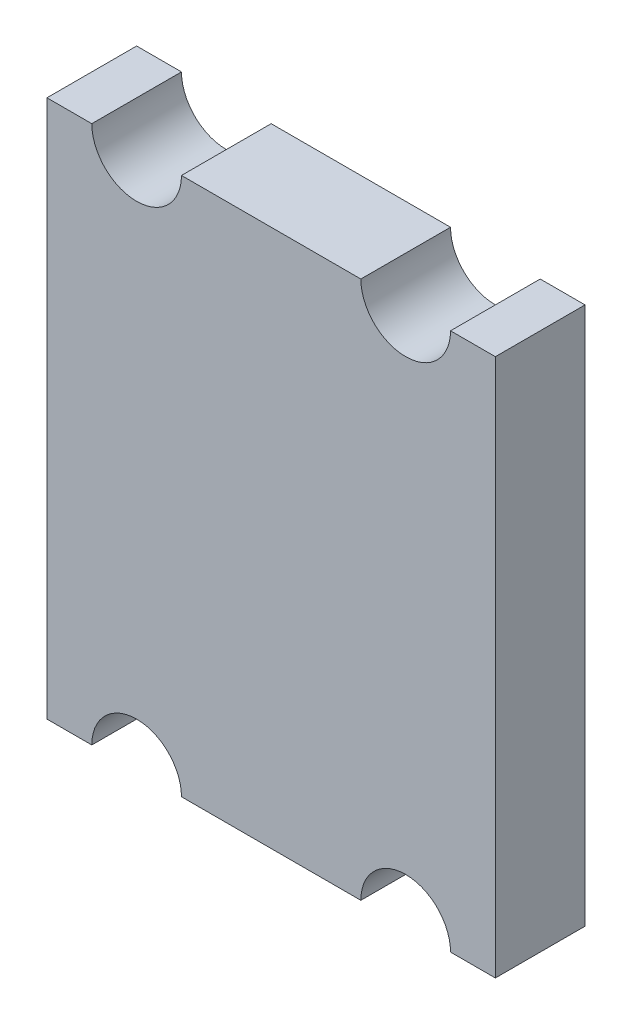
ISO-10303-21;
HEADER;
FILE_DESCRIPTION(('STEP AP214'),'2;1');
FILE_NAME('part.step','',(''),(''),'','','');
FILE_SCHEMA(('AUTOMOTIVE_DESIGN { 1 0 10303 214 1 1 1 1 }'));
ENDSEC;
DATA;
#1=APPLICATION_CONTEXT('core data for automotive mechanical design processes');
#2=APPLICATION_PROTOCOL_DEFINITION('international standard','automotive_design',2000,#1);
#3=PRODUCT_CONTEXT('',#1,'mechanical');
#4=PRODUCT('Part','Part','',(#3));
#5=PRODUCT_RELATED_PRODUCT_CATEGORY('part','',(#4));
#6=PRODUCT_DEFINITION_FORMATION('','',#4);
#7=PRODUCT_DEFINITION_CONTEXT('part definition',#1,'design');
#8=PRODUCT_DEFINITION('design','',#6,#7);
#9=PRODUCT_DEFINITION_SHAPE('','',#8);
#10=(LENGTH_UNIT() NAMED_UNIT(*) SI_UNIT(.MILLI.,.METRE.));
#11=(NAMED_UNIT(*) PLANE_ANGLE_UNIT() SI_UNIT($,.RADIAN.));
#12=(NAMED_UNIT(*) SI_UNIT($,.STERADIAN.) SOLID_ANGLE_UNIT());
#13=UNCERTAINTY_MEASURE_WITH_UNIT(LENGTH_MEASURE(1.E-05),#10,'distance_accuracy_value','');
#14=(GEOMETRIC_REPRESENTATION_CONTEXT(3) GLOBAL_UNCERTAINTY_ASSIGNED_CONTEXT((#13)) GLOBAL_UNIT_ASSIGNED_CONTEXT((#10,
#11,#12)) REPRESENTATION_CONTEXT('',''));
#15=CARTESIAN_POINT('',(0.,0.,0.));
#16=DIRECTION('',(0.,0.,1.));
#17=DIRECTION('',(1.,0.,0.));
#18=AXIS2_PLACEMENT_3D('',#15,#16,#17);
#19=CARTESIAN_POINT('',(0.,0.,0.));
#20=DIRECTION('',(0.,0.,1.));
#21=DIRECTION('',(1.,0.,0.));
#22=AXIS2_PLACEMENT_3D('',#19,#20,#21);
#23=PLANE('',#22);
#24=CARTESIAN_POINT('',(2.,3.,0.));
#25=DIRECTION('',(0.,0.,1.));
#26=DIRECTION('',(1.,0.,0.));
#27=AXIS2_PLACEMENT_3D('',#24,#25,#26);
#28=CIRCLE('',#27,0.25);
#29=CARTESIAN_POINT('',(2.25,3.,0.));
#30=VERTEX_POINT('',#29);
#31=CARTESIAN_POINT('',(1.75,3.,0.));
#32=VERTEX_POINT('',#31);
#33=EDGE_CURVE('E20',#30,#32,#28,.F.);
#34=ORIENTED_EDGE('',*,*,#33,.F.);
#35=DIRECTION('',(1.,0.,0.));
#36=VECTOR('',#35,1.);
#37=CARTESIAN_POINT('',(0.,3.,0.));
#38=LINE('',#37,#36);
#39=CARTESIAN_POINT('',(2.5,3.,0.));
#40=VERTEX_POINT('',#39);
#41=EDGE_CURVE('E90',#40,#30,#38,.F.);
#42=ORIENTED_EDGE('',*,*,#41,.F.);
#43=DIRECTION('',(0.,1.,0.));
#44=VECTOR('',#43,1.);
#45=CARTESIAN_POINT('',(2.5,0.,0.));
#46=LINE('',#45,#44);
#47=CARTESIAN_POINT('',(2.5,0.,0.));
#48=VERTEX_POINT('',#47);
#49=EDGE_CURVE('E116',#48,#40,#46,.T.);
#50=ORIENTED_EDGE('',*,*,#49,.F.);
#51=DIRECTION('',(1.,0.,0.));
#52=VECTOR('',#51,1.);
#53=CARTESIAN_POINT('',(0.,0.,0.));
#54=LINE('',#53,#52);
#55=CARTESIAN_POINT('',(2.25,0.,0.));
#56=VERTEX_POINT('',#55);
#57=EDGE_CURVE('E123',#48,#56,#54,.F.);
#58=ORIENTED_EDGE('',*,*,#57,.T.);
#59=CARTESIAN_POINT('',(2.,0.,0.));
#60=DIRECTION('',(0.,0.,1.));
#61=DIRECTION('',(1.,0.,0.));
#62=AXIS2_PLACEMENT_3D('',#59,#60,#61);
#63=CIRCLE('',#62,0.25);
#64=CARTESIAN_POINT('',(1.75,0.,0.));
#65=VERTEX_POINT('',#64);
#66=EDGE_CURVE('E126',#56,#65,#63,.T.);
#67=ORIENTED_EDGE('',*,*,#66,.T.);
#68=DIRECTION('',(1.,0.,0.));
#69=VECTOR('',#68,1.);
#70=CARTESIAN_POINT('',(0.,0.,0.));
#71=LINE('',#70,#69);
#72=CARTESIAN_POINT('',(0.75,0.,0.));
#73=VERTEX_POINT('',#72);
#74=EDGE_CURVE('E129',#65,#73,#71,.F.);
#75=ORIENTED_EDGE('',*,*,#74,.T.);
#76=CARTESIAN_POINT('',(0.5,0.,0.));
#77=DIRECTION('',(0.,0.,1.));
#78=DIRECTION('',(1.,0.,0.));
#79=AXIS2_PLACEMENT_3D('',#76,#77,#78);
#80=CIRCLE('',#79,0.25);
#81=CARTESIAN_POINT('',(0.25,0.,0.));
#82=VERTEX_POINT('',#81);
#83=EDGE_CURVE('E132',#73,#82,#80,.T.);
#84=ORIENTED_EDGE('',*,*,#83,.T.);
#85=DIRECTION('',(1.,0.,0.));
#86=VECTOR('',#85,1.);
#87=CARTESIAN_POINT('',(0.,0.,0.));
#88=LINE('',#87,#86);
#89=CARTESIAN_POINT('',(0.,0.,0.));
#90=VERTEX_POINT('',#89);
#91=EDGE_CURVE('E133',#82,#90,#88,.F.);
#92=ORIENTED_EDGE('',*,*,#91,.T.);
#93=DIRECTION('',(0.,1.,0.));
#94=VECTOR('',#93,1.);
#95=CARTESIAN_POINT('',(0.,0.,0.));
#96=LINE('',#95,#94);
#97=CARTESIAN_POINT('',(0.,3.,0.));
#98=VERTEX_POINT('',#97);
#99=EDGE_CURVE('E140',#90,#98,#96,.T.);
#100=ORIENTED_EDGE('',*,*,#99,.T.);
#101=DIRECTION('',(1.,0.,0.));
#102=VECTOR('',#101,1.);
#103=CARTESIAN_POINT('',(0.,3.,0.));
#104=LINE('',#103,#102);
#105=CARTESIAN_POINT('',(0.25,3.,0.));
#106=VERTEX_POINT('',#105);
#107=EDGE_CURVE('E143',#106,#98,#104,.F.);
#108=ORIENTED_EDGE('',*,*,#107,.F.);
#109=CARTESIAN_POINT('',(0.5,3.,0.));
#110=DIRECTION('',(0.,0.,1.));
#111=DIRECTION('',(1.,0.,0.));
#112=AXIS2_PLACEMENT_3D('',#109,#110,#111);
#113=CIRCLE('',#112,0.25);
#114=CARTESIAN_POINT('',(0.75,3.,0.));
#115=VERTEX_POINT('',#114);
#116=EDGE_CURVE('E112',#106,#115,#113,.T.);
#117=ORIENTED_EDGE('',*,*,#116,.T.);
#118=DIRECTION('',(1.,0.,0.));
#119=VECTOR('',#118,1.);
#120=CARTESIAN_POINT('',(0.,3.,0.));
#121=LINE('',#120,#119);
#122=EDGE_CURVE('E107',#32,#115,#121,.F.);
#123=ORIENTED_EDGE('',*,*,#122,.F.);
#124=EDGE_LOOP('',(#34,#42,#50,#58,#67,#75,#84,#92,#100,#108,#117,#123));
#125=FACE_BOUND('',#124,.T.);
#126=ADVANCED_FACE('F17',(#125),#23,.F.);
#127=CARTESIAN_POINT('',(0.,3.,0.));
#128=DIRECTION('',(0.,1.,0.));
#129=DIRECTION('',(0.,0.,1.));
#130=AXIS2_PLACEMENT_3D('',#127,#128,#129);
#131=PLANE('',#130);
#132=ORIENTED_EDGE('',*,*,#122,.T.);
#133=DIRECTION('',(0.,0.,1.));
#134=VECTOR('',#133,1.);
#135=CARTESIAN_POINT('',(0.75,3.,0.5));
#136=LINE('',#135,#134);
#137=CARTESIAN_POINT('',(0.75,3.,0.5));
#138=VERTEX_POINT('',#137);
#139=EDGE_CURVE('E109',#115,#138,#136,.T.);
#140=ORIENTED_EDGE('',*,*,#139,.T.);
#141=DIRECTION('',(1.,0.,0.));
#142=VECTOR('',#141,1.);
#143=CARTESIAN_POINT('',(0.,3.,0.5));
#144=LINE('',#143,#142);
#145=CARTESIAN_POINT('',(1.75,3.,0.5));
#146=VERTEX_POINT('',#145);
#147=EDGE_CURVE('E164',#146,#138,#144,.F.);
#148=ORIENTED_EDGE('',*,*,#147,.F.);
#149=DIRECTION('',(0.,0.,1.));
#150=VECTOR('',#149,1.);
#151=CARTESIAN_POINT('',(1.75,3.,0.5));
#152=LINE('',#151,#150);
#153=EDGE_CURVE('E104',#146,#32,#152,.F.);
#154=ORIENTED_EDGE('',*,*,#153,.T.);
#155=EDGE_LOOP('',(#132,#140,#148,#154));
#156=FACE_BOUND('',#155,.T.);
#157=ADVANCED_FACE('F249',(#156),#131,.T.);
#158=CARTESIAN_POINT('',(0.5,3.,0.5));
#159=DIRECTION('',(0.,0.,1.));
#160=DIRECTION('',(1.,0.,0.));
#161=AXIS2_PLACEMENT_3D('',#158,#159,#160);
#162=CYLINDRICAL_SURFACE('',#161,0.25);
#163=DIRECTION('',(0.,0.,1.));
#164=VECTOR('',#163,1.);
#165=CARTESIAN_POINT('',(0.25,3.,0.));
#166=LINE('',#165,#164);
#167=CARTESIAN_POINT('',(0.25,3.,0.5));
#168=VERTEX_POINT('',#167);
#169=EDGE_CURVE('E148',#168,#106,#166,.F.);
#170=ORIENTED_EDGE('',*,*,#169,.F.);
#171=CARTESIAN_POINT('',(0.5,3.,0.5));
#172=DIRECTION('',(0.,0.,1.));
#173=DIRECTION('',(1.,0.,0.));
#174=AXIS2_PLACEMENT_3D('',#171,#172,#173);
#175=CIRCLE('',#174,0.25);
#176=EDGE_CURVE('E160',#138,#168,#175,.F.);
#177=ORIENTED_EDGE('',*,*,#176,.F.);
#178=ORIENTED_EDGE('',*,*,#139,.F.);
#179=ORIENTED_EDGE('',*,*,#116,.F.);
#180=EDGE_LOOP('',(#170,#177,#178,#179));
#181=FACE_BOUND('',#180,.T.);
#182=ADVANCED_FACE('F248',(#181),#162,.F.);
#183=CARTESIAN_POINT('',(0.,3.,0.));
#184=DIRECTION('',(0.,1.,0.));
#185=DIRECTION('',(0.,0.,1.));
#186=AXIS2_PLACEMENT_3D('',#183,#184,#185);
#187=PLANE('',#186);
#188=ORIENTED_EDGE('',*,*,#107,.T.);
#189=DIRECTION('',(0.,0.,-1.));
#190=VECTOR('',#189,1.);
#191=CARTESIAN_POINT('',(0.,3.,0.));
#192=LINE('',#191,#190);
#193=CARTESIAN_POINT('',(0.,3.,0.5));
#194=VERTEX_POINT('',#193);
#195=EDGE_CURVE('E137',#98,#194,#192,.F.);
#196=ORIENTED_EDGE('',*,*,#195,.T.);
#197=DIRECTION('',(1.,0.,0.));
#198=VECTOR('',#197,1.);
#199=CARTESIAN_POINT('',(0.,3.,0.5));
#200=LINE('',#199,#198);
#201=EDGE_CURVE('E163',#168,#194,#200,.F.);
#202=ORIENTED_EDGE('',*,*,#201,.F.);
#203=ORIENTED_EDGE('',*,*,#169,.T.);
#204=EDGE_LOOP('',(#188,#196,#202,#203));
#205=FACE_BOUND('',#204,.T.);
#206=ADVANCED_FACE('F242',(#205),#187,.T.);
#207=CARTESIAN_POINT('',(0.,0.,0.));
#208=DIRECTION('',(1.,0.,0.));
#209=DIRECTION('',(0.,0.,-1.));
#210=AXIS2_PLACEMENT_3D('',#207,#208,#209);
#211=PLANE('',#210);
#212=ORIENTED_EDGE('',*,*,#99,.F.);
#213=DIRECTION('',(0.,0.,1.));
#214=VECTOR('',#213,1.);
#215=CARTESIAN_POINT('',(0.,0.,0.));
#216=LINE('',#215,#214);
#217=CARTESIAN_POINT('',(0.,0.,0.5));
#218=VERTEX_POINT('',#217);
#219=EDGE_CURVE('E136',#90,#218,#216,.T.);
#220=ORIENTED_EDGE('',*,*,#219,.T.);
#221=DIRECTION('',(0.,1.,0.));
#222=VECTOR('',#221,1.);
#223=CARTESIAN_POINT('',(0.,0.,0.5));
#224=LINE('',#223,#222);
#225=EDGE_CURVE('E182',#194,#218,#224,.F.);
#226=ORIENTED_EDGE('',*,*,#225,.F.);
#227=ORIENTED_EDGE('',*,*,#195,.F.);
#228=EDGE_LOOP('',(#212,#220,#226,#227));
#229=FACE_BOUND('',#228,.T.);
#230=ADVANCED_FACE('F244',(#229),#211,.F.);
#231=CARTESIAN_POINT('',(0.,0.,0.));
#232=DIRECTION('',(0.,1.,0.));
#233=DIRECTION('',(0.,0.,1.));
#234=AXIS2_PLACEMENT_3D('',#231,#232,#233);
#235=PLANE('',#234);
#236=ORIENTED_EDGE('',*,*,#219,.F.);
#237=ORIENTED_EDGE('',*,*,#91,.F.);
#238=DIRECTION('',(0.,0.,1.));
#239=VECTOR('',#238,1.);
#240=CARTESIAN_POINT('',(0.25,0.,0.5));
#241=LINE('',#240,#239);
#242=CARTESIAN_POINT('',(0.25,0.,0.5));
#243=VERTEX_POINT('',#242);
#244=EDGE_CURVE('E169',#82,#243,#241,.T.);
#245=ORIENTED_EDGE('',*,*,#244,.T.);
#246=DIRECTION('',(1.,0.,0.));
#247=VECTOR('',#246,1.);
#248=CARTESIAN_POINT('',(0.,0.,0.5));
#249=LINE('',#248,#247);
#250=EDGE_CURVE('E159',#218,#243,#249,.T.);
#251=ORIENTED_EDGE('',*,*,#250,.F.);
#252=EDGE_LOOP('',(#236,#237,#245,#251));
#253=FACE_BOUND('',#252,.T.);
#254=ADVANCED_FACE('F282',(#253),#235,.F.);
#255=CARTESIAN_POINT('',(0.5,0.,0.5));
#256=DIRECTION('',(0.,0.,1.));
#257=DIRECTION('',(1.,0.,0.));
#258=AXIS2_PLACEMENT_3D('',#255,#256,#257);
#259=CYLINDRICAL_SURFACE('',#258,0.25);
#260=DIRECTION('',(0.,0.,1.));
#261=VECTOR('',#260,1.);
#262=CARTESIAN_POINT('',(0.75,0.,0.));
#263=LINE('',#262,#261);
#264=CARTESIAN_POINT('',(0.75,0.,0.5));
#265=VERTEX_POINT('',#264);
#266=EDGE_CURVE('E131',#73,#265,#263,.T.);
#267=ORIENTED_EDGE('',*,*,#266,.T.);
#268=CARTESIAN_POINT('',(0.5,0.,0.5));
#269=DIRECTION('',(0.,0.,1.));
#270=DIRECTION('',(1.,0.,0.));
#271=AXIS2_PLACEMENT_3D('',#268,#269,#270);
#272=CIRCLE('',#271,0.25);
#273=EDGE_CURVE('E156',#243,#265,#272,.F.);
#274=ORIENTED_EDGE('',*,*,#273,.F.);
#275=ORIENTED_EDGE('',*,*,#244,.F.);
#276=ORIENTED_EDGE('',*,*,#83,.F.);
#277=EDGE_LOOP('',(#267,#274,#275,#276));
#278=FACE_BOUND('',#277,.T.);
#279=ADVANCED_FACE('F278',(#278),#259,.F.);
#280=CARTESIAN_POINT('',(0.,0.,0.));
#281=DIRECTION('',(0.,1.,0.));
#282=DIRECTION('',(0.,0.,1.));
#283=AXIS2_PLACEMENT_3D('',#280,#281,#282);
#284=PLANE('',#283);
#285=ORIENTED_EDGE('',*,*,#266,.F.);
#286=ORIENTED_EDGE('',*,*,#74,.F.);
#287=DIRECTION('',(0.,0.,1.));
#288=VECTOR('',#287,1.);
#289=CARTESIAN_POINT('',(1.75,0.,0.5));
#290=LINE('',#289,#288);
#291=CARTESIAN_POINT('',(1.75,0.,0.5));
#292=VERTEX_POINT('',#291);
#293=EDGE_CURVE('E167',#65,#292,#290,.T.);
#294=ORIENTED_EDGE('',*,*,#293,.T.);
#295=DIRECTION('',(1.,0.,0.));
#296=VECTOR('',#295,1.);
#297=CARTESIAN_POINT('',(0.,0.,0.5));
#298=LINE('',#297,#296);
#299=EDGE_CURVE('E155',#265,#292,#298,.T.);
#300=ORIENTED_EDGE('',*,*,#299,.F.);
#301=EDGE_LOOP('',(#285,#286,#294,#300));
#302=FACE_BOUND('',#301,.T.);
#303=ADVANCED_FACE('F274',(#302),#284,.F.);
#304=CARTESIAN_POINT('',(2.,0.,0.5));
#305=DIRECTION('',(0.,0.,1.));
#306=DIRECTION('',(1.,0.,0.));
#307=AXIS2_PLACEMENT_3D('',#304,#305,#306);
#308=CYLINDRICAL_SURFACE('',#307,0.25);
#309=DIRECTION('',(0.,0.,1.));
#310=VECTOR('',#309,1.);
#311=CARTESIAN_POINT('',(2.25,0.,0.));
#312=LINE('',#311,#310);
#313=CARTESIAN_POINT('',(2.25,0.,0.5));
#314=VERTEX_POINT('',#313);
#315=EDGE_CURVE('E125',#56,#314,#312,.T.);
#316=ORIENTED_EDGE('',*,*,#315,.T.);
#317=CARTESIAN_POINT('',(2.,0.,0.5));
#318=DIRECTION('',(0.,0.,1.));
#319=DIRECTION('',(1.,0.,0.));
#320=AXIS2_PLACEMENT_3D('',#317,#318,#319);
#321=CIRCLE('',#320,0.25);
#322=EDGE_CURVE('E151',#292,#314,#321,.F.);
#323=ORIENTED_EDGE('',*,*,#322,.F.);
#324=ORIENTED_EDGE('',*,*,#293,.F.);
#325=ORIENTED_EDGE('',*,*,#66,.F.);
#326=EDGE_LOOP('',(#316,#323,#324,#325));
#327=FACE_BOUND('',#326,.T.);
#328=ADVANCED_FACE('F271',(#327),#308,.F.);
#329=CARTESIAN_POINT('',(0.,0.,0.));
#330=DIRECTION('',(0.,1.,0.));
#331=DIRECTION('',(0.,0.,1.));
#332=AXIS2_PLACEMENT_3D('',#329,#330,#331);
#333=PLANE('',#332);
#334=ORIENTED_EDGE('',*,*,#315,.F.);
#335=ORIENTED_EDGE('',*,*,#57,.F.);
#336=DIRECTION('',(0.,0.,-1.));
#337=VECTOR('',#336,1.);
#338=CARTESIAN_POINT('',(2.5,0.,0.));
#339=LINE('',#338,#337);
#340=CARTESIAN_POINT('',(2.5,0.,0.5));
#341=VERTEX_POINT('',#340);
#342=EDGE_CURVE('E118',#341,#48,#339,.T.);
#343=ORIENTED_EDGE('',*,*,#342,.F.);
#344=DIRECTION('',(1.,0.,0.));
#345=VECTOR('',#344,1.);
#346=CARTESIAN_POINT('',(0.,0.,0.5));
#347=LINE('',#346,#345);
#348=EDGE_CURVE('E154',#314,#341,#347,.T.);
#349=ORIENTED_EDGE('',*,*,#348,.F.);
#350=EDGE_LOOP('',(#334,#335,#343,#349));
#351=FACE_BOUND('',#350,.T.);
#352=ADVANCED_FACE('F268',(#351),#333,.F.);
#353=CARTESIAN_POINT('',(2.5,0.,0.));
#354=DIRECTION('',(1.,0.,0.));
#355=DIRECTION('',(0.,0.,-1.));
#356=AXIS2_PLACEMENT_3D('',#353,#354,#355);
#357=PLANE('',#356);
#358=ORIENTED_EDGE('',*,*,#342,.T.);
#359=ORIENTED_EDGE('',*,*,#49,.T.);
#360=DIRECTION('',(0.,0.,1.));
#361=VECTOR('',#360,1.);
#362=CARTESIAN_POINT('',(2.5,3.,0.));
#363=LINE('',#362,#361);
#364=CARTESIAN_POINT('',(2.5,3.,0.5));
#365=VERTEX_POINT('',#364);
#366=EDGE_CURVE('E92',#365,#40,#363,.F.);
#367=ORIENTED_EDGE('',*,*,#366,.F.);
#368=DIRECTION('',(0.,1.,0.));
#369=VECTOR('',#368,1.);
#370=CARTESIAN_POINT('',(2.5,0.,0.5));
#371=LINE('',#370,#369);
#372=EDGE_CURVE('E199',#341,#365,#371,.T.);
#373=ORIENTED_EDGE('',*,*,#372,.F.);
#374=EDGE_LOOP('',(#358,#359,#367,#373));
#375=FACE_BOUND('',#374,.T.);
#376=ADVANCED_FACE('F229',(#375),#357,.T.);
#377=CARTESIAN_POINT('',(0.,3.,0.));
#378=DIRECTION('',(0.,1.,0.));
#379=DIRECTION('',(0.,0.,1.));
#380=AXIS2_PLACEMENT_3D('',#377,#378,#379);
#381=PLANE('',#380);
#382=ORIENTED_EDGE('',*,*,#41,.T.);
#383=DIRECTION('',(0.,0.,1.));
#384=VECTOR('',#383,1.);
#385=CARTESIAN_POINT('',(2.25,3.,0.5));
#386=LINE('',#385,#384);
#387=CARTESIAN_POINT('',(2.25,3.,0.5));
#388=VERTEX_POINT('',#387);
#389=EDGE_CURVE('E35',#30,#388,#386,.T.);
#390=ORIENTED_EDGE('',*,*,#389,.T.);
#391=DIRECTION('',(1.,0.,0.));
#392=VECTOR('',#391,1.);
#393=CARTESIAN_POINT('',(0.,3.,0.5));
#394=LINE('',#393,#392);
#395=EDGE_CURVE('E26',#365,#388,#394,.F.);
#396=ORIENTED_EDGE('',*,*,#395,.F.);
#397=ORIENTED_EDGE('',*,*,#366,.T.);
#398=EDGE_LOOP('',(#382,#390,#396,#397));
#399=FACE_BOUND('',#398,.T.);
#400=ADVANCED_FACE('F91',(#399),#381,.T.);
#401=CARTESIAN_POINT('',(2.,3.,0.5));
#402=DIRECTION('',(0.,0.,1.));
#403=DIRECTION('',(1.,0.,0.));
#404=AXIS2_PLACEMENT_3D('',#401,#402,#403);
#405=CYLINDRICAL_SURFACE('',#404,0.25);
#406=ORIENTED_EDGE('',*,*,#153,.F.);
#407=CARTESIAN_POINT('',(2.,3.,0.5));
#408=DIRECTION('',(0.,0.,1.));
#409=DIRECTION('',(1.,0.,0.));
#410=AXIS2_PLACEMENT_3D('',#407,#408,#409);
#411=CIRCLE('',#410,0.25);
#412=EDGE_CURVE('E11',#388,#146,#411,.F.);
#413=ORIENTED_EDGE('',*,*,#412,.F.);
#414=ORIENTED_EDGE('',*,*,#389,.F.);
#415=ORIENTED_EDGE('',*,*,#33,.T.);
#416=EDGE_LOOP('',(#406,#413,#414,#415));
#417=FACE_BOUND('',#416,.T.);
#418=ADVANCED_FACE('F101',(#417),#405,.F.);
#419=CARTESIAN_POINT('',(0.,0.,0.5));
#420=DIRECTION('',(0.,0.,1.));
#421=DIRECTION('',(1.,0.,0.));
#422=AXIS2_PLACEMENT_3D('',#419,#420,#421);
#423=PLANE('',#422);
#424=ORIENTED_EDGE('',*,*,#395,.T.);
#425=ORIENTED_EDGE('',*,*,#412,.T.);
#426=ORIENTED_EDGE('',*,*,#147,.T.);
#427=ORIENTED_EDGE('',*,*,#176,.T.);
#428=ORIENTED_EDGE('',*,*,#201,.T.);
#429=ORIENTED_EDGE('',*,*,#225,.T.);
#430=ORIENTED_EDGE('',*,*,#250,.T.);
#431=ORIENTED_EDGE('',*,*,#273,.T.);
#432=ORIENTED_EDGE('',*,*,#299,.T.);
#433=ORIENTED_EDGE('',*,*,#322,.T.);
#434=ORIENTED_EDGE('',*,*,#348,.T.);
#435=ORIENTED_EDGE('',*,*,#372,.T.);
#436=EDGE_LOOP('',(#424,#425,#426,#427,#428,#429,#430,#431,#432,#433,#434,#435));
#437=FACE_BOUND('',#436,.T.);
#438=ADVANCED_FACE('F225',(#437),#423,.T.);
#439=CLOSED_SHELL('',(#126,#157,#182,#206,#230,#254,#279,#303,#328,#352,#376,#400,#418,#438));
#440=MANIFOLD_SOLID_BREP('B1',#439);
#441=ADVANCED_BREP_SHAPE_REPRESENTATION('',(#18,#440),#14);
#442=SHAPE_DEFINITION_REPRESENTATION(#9,#441);
ENDSEC;
END-ISO-10303-21;
